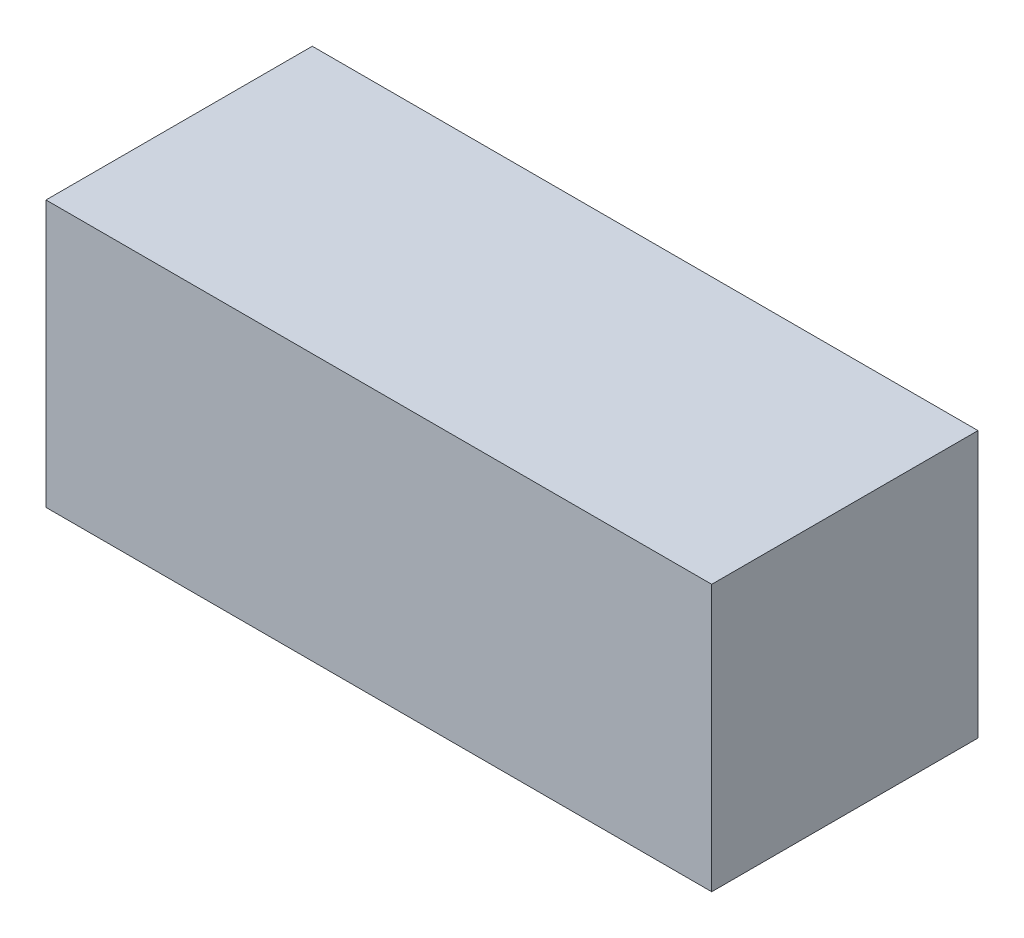
ISO-10303-21;
HEADER;
FILE_DESCRIPTION(('STEP AP214'),'2;1');
FILE_NAME('part.step','',(''),(''),'','','');
FILE_SCHEMA(('AUTOMOTIVE_DESIGN { 1 0 10303 214 1 1 1 1 }'));
ENDSEC;
DATA;
#1=APPLICATION_CONTEXT('core data for automotive mechanical design processes');
#2=APPLICATION_PROTOCOL_DEFINITION('international standard','automotive_design',2000,#1);
#3=PRODUCT_CONTEXT('',#1,'mechanical');
#4=PRODUCT('Part','Part','',(#3));
#5=PRODUCT_RELATED_PRODUCT_CATEGORY('part','',(#4));
#6=PRODUCT_DEFINITION_FORMATION('','',#4);
#7=PRODUCT_DEFINITION_CONTEXT('part definition',#1,'design');
#8=PRODUCT_DEFINITION('design','',#6,#7);
#9=PRODUCT_DEFINITION_SHAPE('','',#8);
#10=(LENGTH_UNIT() NAMED_UNIT(*) SI_UNIT(.MILLI.,.METRE.));
#11=(NAMED_UNIT(*) PLANE_ANGLE_UNIT() SI_UNIT($,.RADIAN.));
#12=(NAMED_UNIT(*) SI_UNIT($,.STERADIAN.) SOLID_ANGLE_UNIT());
#13=UNCERTAINTY_MEASURE_WITH_UNIT(LENGTH_MEASURE(1.E-05),#10,'distance_accuracy_value','');
#14=(GEOMETRIC_REPRESENTATION_CONTEXT(3) GLOBAL_UNCERTAINTY_ASSIGNED_CONTEXT((#13)) GLOBAL_UNIT_ASSIGNED_CONTEXT((#10,
#11,#12)) REPRESENTATION_CONTEXT('',''));
#15=CARTESIAN_POINT('',(0.,0.,0.));
#16=DIRECTION('',(0.,0.,1.));
#17=DIRECTION('',(1.,0.,0.));
#18=AXIS2_PLACEMENT_3D('',#15,#16,#17);
#19=CARTESIAN_POINT('',(47.625,-19.05,-19.05));
#20=DIRECTION('',(0.,0.,1.));
#21=DIRECTION('',(1.,0.,0.));
#22=AXIS2_PLACEMENT_3D('',#19,#20,#21);
#23=PLANE('',#22);
#24=DIRECTION('',(0.,1.,0.));
#25=VECTOR('',#24,1.);
#26=CARTESIAN_POINT('',(-47.625,-19.05,-19.05));
#27=LINE('',#26,#25);
#28=CARTESIAN_POINT('',(-47.625,-19.05,-19.05));
#29=VERTEX_POINT('',#28);
#30=CARTESIAN_POINT('',(-47.625,19.05,-19.05));
#31=VERTEX_POINT('',#30);
#32=EDGE_CURVE('E96',#29,#31,#27,.T.);
#33=ORIENTED_EDGE('',*,*,#32,.T.);
#34=DIRECTION('',(-1.,0.,0.));
#35=VECTOR('',#34,1.);
#36=CARTESIAN_POINT('',(47.625,19.05,-19.05));
#37=LINE('',#36,#35);
#38=CARTESIAN_POINT('',(47.625,19.05,-19.05));
#39=VERTEX_POINT('',#38);
#40=EDGE_CURVE('E11',#39,#31,#37,.T.);
#41=ORIENTED_EDGE('',*,*,#40,.F.);
#42=DIRECTION('',(0.,1.,0.));
#43=VECTOR('',#42,1.);
#44=CARTESIAN_POINT('',(47.625,-19.05,-19.05));
#45=LINE('',#44,#43);
#46=CARTESIAN_POINT('',(47.625,-19.05,-19.05));
#47=VERTEX_POINT('',#46);
#48=EDGE_CURVE('E84',#47,#39,#45,.T.);
#49=ORIENTED_EDGE('',*,*,#48,.F.);
#50=DIRECTION('',(-1.,0.,0.));
#51=VECTOR('',#50,1.);
#52=CARTESIAN_POINT('',(47.625,-19.05,-19.05));
#53=LINE('',#52,#51);
#54=EDGE_CURVE('E92',#47,#29,#53,.T.);
#55=ORIENTED_EDGE('',*,*,#54,.T.);
#56=EDGE_LOOP('',(#33,#41,#49,#55));
#57=FACE_BOUND('',#56,.T.);
#58=ADVANCED_FACE('F33',(#57),#23,.F.);
#59=CARTESIAN_POINT('',(47.625,19.05,19.05));
#60=DIRECTION('',(0.,-1.,0.));
#61=DIRECTION('',(0.,0.,-1.));
#62=AXIS2_PLACEMENT_3D('',#59,#60,#61);
#63=PLANE('',#62);
#64=DIRECTION('',(0.,0.,1.));
#65=VECTOR('',#64,1.);
#66=CARTESIAN_POINT('',(-47.625,19.05,19.05));
#67=LINE('',#66,#65);
#68=CARTESIAN_POINT('',(-47.625,19.05,19.05));
#69=VERTEX_POINT('',#68);
#70=EDGE_CURVE('E88',#31,#69,#67,.T.);
#71=ORIENTED_EDGE('',*,*,#70,.T.);
#72=DIRECTION('',(-1.,0.,0.));
#73=VECTOR('',#72,1.);
#74=CARTESIAN_POINT('',(47.625,19.05,19.05));
#75=LINE('',#74,#73);
#76=CARTESIAN_POINT('',(47.625,19.05,19.05));
#77=VERTEX_POINT('',#76);
#78=EDGE_CURVE('E41',#77,#69,#75,.T.);
#79=ORIENTED_EDGE('',*,*,#78,.F.);
#80=DIRECTION('',(0.,0.,1.));
#81=VECTOR('',#80,1.);
#82=CARTESIAN_POINT('',(47.625,19.05,19.05));
#83=LINE('',#82,#81);
#84=EDGE_CURVE('E79',#39,#77,#83,.T.);
#85=ORIENTED_EDGE('',*,*,#84,.F.);
#86=ORIENTED_EDGE('',*,*,#40,.T.);
#87=EDGE_LOOP('',(#71,#79,#85,#86));
#88=FACE_BOUND('',#87,.T.);
#89=ADVANCED_FACE('F87',(#88),#63,.F.);
#90=CARTESIAN_POINT('',(47.625,-19.05,19.05));
#91=DIRECTION('',(0.,0.,-1.));
#92=DIRECTION('',(-1.,0.,0.));
#93=AXIS2_PLACEMENT_3D('',#90,#91,#92);
#94=PLANE('',#93);
#95=DIRECTION('',(0.,-1.,0.));
#96=VECTOR('',#95,1.);
#97=CARTESIAN_POINT('',(-47.625,-19.05,19.05));
#98=LINE('',#97,#96);
#99=CARTESIAN_POINT('',(-47.625,-19.05,19.05));
#100=VERTEX_POINT('',#99);
#101=EDGE_CURVE('E66',#69,#100,#98,.T.);
#102=ORIENTED_EDGE('',*,*,#101,.T.);
#103=DIRECTION('',(-1.,0.,0.));
#104=VECTOR('',#103,1.);
#105=CARTESIAN_POINT('',(47.625,-19.05,19.05));
#106=LINE('',#105,#104);
#107=CARTESIAN_POINT('',(47.625,-19.05,19.05));
#108=VERTEX_POINT('',#107);
#109=EDGE_CURVE('E89',#108,#100,#106,.T.);
#110=ORIENTED_EDGE('',*,*,#109,.F.);
#111=DIRECTION('',(0.,-1.,0.));
#112=VECTOR('',#111,1.);
#113=CARTESIAN_POINT('',(47.625,-19.05,19.05));
#114=LINE('',#113,#112);
#115=EDGE_CURVE('E82',#77,#108,#114,.T.);
#116=ORIENTED_EDGE('',*,*,#115,.F.);
#117=ORIENTED_EDGE('',*,*,#78,.T.);
#118=EDGE_LOOP('',(#102,#110,#116,#117));
#119=FACE_BOUND('',#118,.T.);
#120=ADVANCED_FACE('F90',(#119),#94,.F.);
#121=CARTESIAN_POINT('',(47.625,-19.05,19.05));
#122=DIRECTION('',(0.,1.,0.));
#123=DIRECTION('',(0.,0.,1.));
#124=AXIS2_PLACEMENT_3D('',#121,#122,#123);
#125=PLANE('',#124);
#126=DIRECTION('',(0.,0.,-1.));
#127=VECTOR('',#126,1.);
#128=CARTESIAN_POINT('',(-47.625,-19.05,19.05));
#129=LINE('',#128,#127);
#130=EDGE_CURVE('E72',#100,#29,#129,.T.);
#131=ORIENTED_EDGE('',*,*,#130,.T.);
#132=ORIENTED_EDGE('',*,*,#54,.F.);
#133=DIRECTION('',(0.,0.,-1.));
#134=VECTOR('',#133,1.);
#135=CARTESIAN_POINT('',(47.625,-19.05,19.05));
#136=LINE('',#135,#134);
#137=EDGE_CURVE('E49',#108,#47,#136,.T.);
#138=ORIENTED_EDGE('',*,*,#137,.F.);
#139=ORIENTED_EDGE('',*,*,#109,.T.);
#140=EDGE_LOOP('',(#131,#132,#138,#139));
#141=FACE_BOUND('',#140,.T.);
#142=ADVANCED_FACE('F103',(#141),#125,.F.);
#143=CARTESIAN_POINT('',(47.625,0.,0.));
#144=DIRECTION('',(-1.,0.,0.));
#145=DIRECTION('',(0.,0.,1.));
#146=AXIS2_PLACEMENT_3D('',#143,#144,#145);
#147=PLANE('',#146);
#148=ORIENTED_EDGE('',*,*,#48,.T.);
#149=ORIENTED_EDGE('',*,*,#84,.T.);
#150=ORIENTED_EDGE('',*,*,#115,.T.);
#151=ORIENTED_EDGE('',*,*,#137,.T.);
#152=EDGE_LOOP('',(#148,#149,#150,#151));
#153=FACE_BOUND('',#152,.T.);
#154=ADVANCED_FACE('F80',(#153),#147,.F.);
#155=CARTESIAN_POINT('',(-47.625,0.,0.));
#156=DIRECTION('',(-1.,0.,0.));
#157=DIRECTION('',(0.,0.,1.));
#158=AXIS2_PLACEMENT_3D('',#155,#156,#157);
#159=PLANE('',#158);
#160=ORIENTED_EDGE('',*,*,#32,.F.);
#161=ORIENTED_EDGE('',*,*,#130,.F.);
#162=ORIENTED_EDGE('',*,*,#101,.F.);
#163=ORIENTED_EDGE('',*,*,#70,.F.);
#164=EDGE_LOOP('',(#160,#161,#162,#163));
#165=FACE_BOUND('',#164,.T.);
#166=ADVANCED_FACE('F106',(#165),#159,.T.);
#167=CLOSED_SHELL('',(#58,#89,#120,#142,#154,#166));
#168=MANIFOLD_SOLID_BREP('B2',#167);
#169=ADVANCED_BREP_SHAPE_REPRESENTATION('',(#18,#168),#14);
#170=SHAPE_DEFINITION_REPRESENTATION(#9,#169);
ENDSEC;
END-ISO-10303-21;
